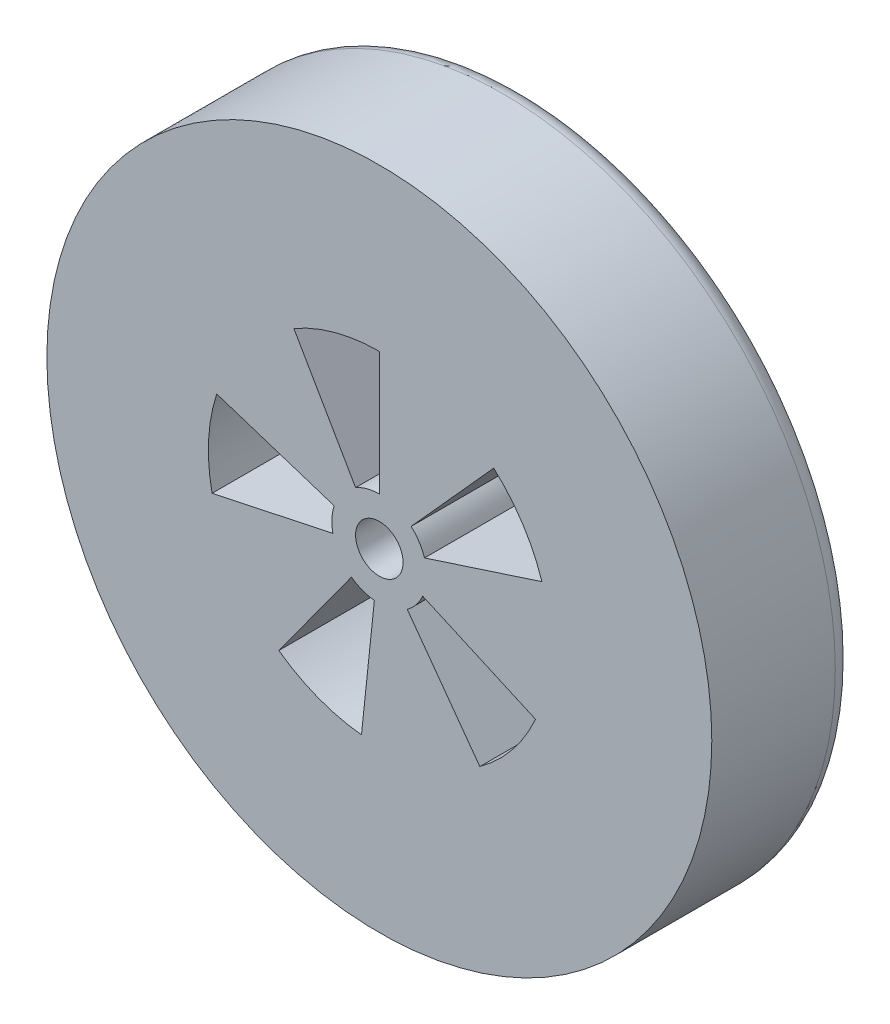
ISO-10303-21;
HEADER;
FILE_DESCRIPTION(('STEP AP214'),'2;1');
FILE_NAME('part.step','',(''),(''),'','','');
FILE_SCHEMA(('AUTOMOTIVE_DESIGN { 1 0 10303 214 1 1 1 1 }'));
ENDSEC;
DATA;
#1=APPLICATION_CONTEXT('core data for automotive mechanical design processes');
#2=APPLICATION_PROTOCOL_DEFINITION('international standard','automotive_design',2000,#1);
#3=PRODUCT_CONTEXT('',#1,'mechanical');
#4=PRODUCT('Part','Part','',(#3));
#5=PRODUCT_RELATED_PRODUCT_CATEGORY('part','',(#4));
#6=PRODUCT_DEFINITION_FORMATION('','',#4);
#7=PRODUCT_DEFINITION_CONTEXT('part definition',#1,'design');
#8=PRODUCT_DEFINITION('design','',#6,#7);
#9=PRODUCT_DEFINITION_SHAPE('','',#8);
#10=(LENGTH_UNIT() NAMED_UNIT(*) SI_UNIT(.MILLI.,.METRE.));
#11=(NAMED_UNIT(*) PLANE_ANGLE_UNIT() SI_UNIT($,.RADIAN.));
#12=(NAMED_UNIT(*) SI_UNIT($,.STERADIAN.) SOLID_ANGLE_UNIT());
#13=UNCERTAINTY_MEASURE_WITH_UNIT(LENGTH_MEASURE(1.E-05),#10,'distance_accuracy_value','');
#14=(GEOMETRIC_REPRESENTATION_CONTEXT(3) GLOBAL_UNCERTAINTY_ASSIGNED_CONTEXT((#13)) GLOBAL_UNIT_ASSIGNED_CONTEXT((#10,
#11,#12)) REPRESENTATION_CONTEXT('',''));
#15=CARTESIAN_POINT('',(0.,0.,0.));
#16=DIRECTION('',(0.,0.,1.));
#17=DIRECTION('',(1.,0.,0.));
#18=AXIS2_PLACEMENT_3D('',#15,#16,#17);
#19=CARTESIAN_POINT('',(0.,0.,15.));
#20=DIRECTION('',(0.,0.,-1.));
#21=DIRECTION('',(-1.,0.,0.));
#22=AXIS2_PLACEMENT_3D('',#19,#20,#21);
#23=CYLINDRICAL_SURFACE('',#22,35.);
#24=CARTESIAN_POINT('',(0.,0.,2.));
#25=DIRECTION('',(0.,0.,1.));
#26=DIRECTION('',(1.,0.,0.));
#27=AXIS2_PLACEMENT_3D('',#24,#25,#26);
#28=CIRCLE('',#27,35.);
#29=CARTESIAN_POINT('',(35.,0.,2.));
#30=VERTEX_POINT('',#29);
#31=EDGE_CURVE('E349',#30,#30,#28,.T.);
#32=ORIENTED_EDGE('',*,*,#31,.T.);
#33=EDGE_LOOP('',(#32));
#34=FACE_BOUND('',#33,.T.);
#35=CARTESIAN_POINT('',(0.,0.,15.));
#36=DIRECTION('',(0.,0.,1.));
#37=DIRECTION('',(1.,0.,0.));
#38=AXIS2_PLACEMENT_3D('',#35,#36,#37);
#39=CIRCLE('',#38,35.);
#40=CARTESIAN_POINT('',(35.,0.,15.));
#41=VERTEX_POINT('',#40);
#42=EDGE_CURVE('E346',#41,#41,#39,.T.);
#43=ORIENTED_EDGE('',*,*,#42,.F.);
#44=EDGE_LOOP('',(#43));
#45=FACE_BOUND('',#44,.T.);
#46=ADVANCED_FACE('F33',(#34,#45),#23,.T.);
#47=CARTESIAN_POINT('',(0.,0.,15.));
#48=DIRECTION('',(0.,0.,1.));
#49=DIRECTION('',(1.,0.,0.));
#50=AXIS2_PLACEMENT_3D('',#47,#48,#49);
#51=PLANE('',#50);
#52=CARTESIAN_POINT('',(0.,0.,15.));
#53=DIRECTION('',(0.,0.,1.));
#54=DIRECTION('',(1.,0.,0.));
#55=AXIS2_PLACEMENT_3D('',#52,#53,#54);
#56=CIRCLE('',#55,5.);
#57=CARTESIAN_POINT('',(4.75528258147575,1.54508497187479,15.));
#58=VERTEX_POINT('',#57);
#59=CARTESIAN_POINT('',(3.34565303179425,3.71572412738701,15.));
#60=VERTEX_POINT('',#59);
#61=EDGE_CURVE('E278',#58,#60,#56,.T.);
#62=ORIENTED_EDGE('',*,*,#61,.T.);
#63=DIRECTION('',(0.669130606358849,0.743144825477403,0.));
#64=VECTOR('',#63,1.);
#65=CARTESIAN_POINT('',(3.34565303179425,3.71572412738701,15.));
#66=LINE('',#65,#64);
#67=CARTESIAN_POINT('',(12.0443509144593,13.3766068585932,15.));
#68=VERTEX_POINT('',#67);
#69=EDGE_CURVE('E281',#60,#68,#66,.T.);
#70=ORIENTED_EDGE('',*,*,#69,.T.);
#71=CARTESIAN_POINT('',(0.,0.,15.));
#72=DIRECTION('',(0.,0.,-1.));
#73=DIRECTION('',(1.,0.,0.));
#74=AXIS2_PLACEMENT_3D('',#71,#72,#73);
#75=CIRCLE('',#74,18.);
#76=CARTESIAN_POINT('',(17.1190172933127,5.56230589874925,15.));
#77=VERTEX_POINT('',#76);
#78=EDGE_CURVE('E48',#68,#77,#75,.T.);
#79=ORIENTED_EDGE('',*,*,#78,.T.);
#80=DIRECTION('',(-0.95105651629515,-0.309016994374958,0.));
#81=VECTOR('',#80,1.);
#82=CARTESIAN_POINT('',(4.75528258147575,1.54508497187479,15.));
#83=LINE('',#82,#81);
#84=EDGE_CURVE('E286',#77,#58,#83,.T.);
#85=ORIENTED_EDGE('',*,*,#84,.T.);
#86=EDGE_LOOP('',(#62,#70,#79,#85));
#87=FACE_BOUND('',#86,.T.);
#88=CARTESIAN_POINT('',(0.,0.,15.));
#89=DIRECTION('',(0.,0.,1.));
#90=DIRECTION('',(1.,0.,0.));
#91=AXIS2_PLACEMENT_3D('',#88,#89,#90);
#92=CIRCLE('',#91,5.);
#93=CARTESIAN_POINT('',(2.9389262614624,-4.04508497187471,15.));
#94=VERTEX_POINT('',#93);
#95=CARTESIAN_POINT('',(4.56772728821303,-2.03368321537896,15.));
#96=VERTEX_POINT('',#95);
#97=EDGE_CURVE('E249',#94,#96,#92,.T.);
#98=ORIENTED_EDGE('',*,*,#97,.T.);
#99=DIRECTION('',(0.913545457642605,-0.406736643075791,0.));
#100=VECTOR('',#99,1.);
#101=CARTESIAN_POINT('',(4.56772728821303,-2.03368321537896,15.));
#102=LINE('',#101,#100);
#103=CARTESIAN_POINT('',(16.4438182375669,-7.32125957536424,15.));
#104=VERTEX_POINT('',#103);
#105=EDGE_CURVE('E252',#96,#104,#102,.T.);
#106=ORIENTED_EDGE('',*,*,#105,.T.);
#107=CARTESIAN_POINT('',(0.,0.,15.));
#108=DIRECTION('',(0.,0.,-1.));
#109=DIRECTION('',(1.,0.,0.));
#110=AXIS2_PLACEMENT_3D('',#107,#108,#109);
#111=CIRCLE('',#110,18.);
#112=CARTESIAN_POINT('',(10.5801345412646,-14.562305898749,15.));
#113=VERTEX_POINT('',#112);
#114=EDGE_CURVE('E56',#104,#113,#111,.T.);
#115=ORIENTED_EDGE('',*,*,#114,.T.);
#116=DIRECTION('',(-0.58778525229248,0.809016994374942,0.));
#117=VECTOR('',#116,1.);
#118=CARTESIAN_POINT('',(2.9389262614624,-4.04508497187471,15.));
#119=LINE('',#118,#117);
#120=EDGE_CURVE('E257',#113,#94,#119,.T.);
#121=ORIENTED_EDGE('',*,*,#120,.T.);
#122=EDGE_LOOP('',(#98,#106,#115,#121));
#123=FACE_BOUND('',#122,.T.);
#124=CARTESIAN_POINT('',(0.,0.,15.));
#125=DIRECTION('',(0.,0.,1.));
#126=DIRECTION('',(1.,0.,0.));
#127=AXIS2_PLACEMENT_3D('',#124,#125,#126);
#128=CIRCLE('',#127,5.);
#129=CARTESIAN_POINT('',(-2.93892626146234,-4.04508497187476,15.));
#130=VERTEX_POINT('',#129);
#131=CARTESIAN_POINT('',(-0.522642316338235,-4.97260947684137,15.));
#132=VERTEX_POINT('',#131);
#133=EDGE_CURVE('E217',#130,#132,#128,.T.);
#134=ORIENTED_EDGE('',*,*,#133,.T.);
#135=DIRECTION('',(-0.104528463267647,-0.994521895368274,0.));
#136=VECTOR('',#135,1.);
#137=CARTESIAN_POINT('',(-0.522642316338235,-4.97260947684137,15.));
#138=LINE('',#137,#136);
#139=CARTESIAN_POINT('',(-1.88151233881764,-17.9013941166289,15.));
#140=VERTEX_POINT('',#139);
#141=EDGE_CURVE('E220',#132,#140,#138,.T.);
#142=ORIENTED_EDGE('',*,*,#141,.T.);
#143=CARTESIAN_POINT('',(0.,0.,15.));
#144=DIRECTION('',(0.,0.,-1.));
#145=DIRECTION('',(1.,0.,0.));
#146=AXIS2_PLACEMENT_3D('',#143,#144,#145);
#147=CIRCLE('',#146,18.);
#148=CARTESIAN_POINT('',(-10.5801345412644,-14.5623058987491,15.));
#149=VERTEX_POINT('',#148);
#150=EDGE_CURVE('E224',#140,#149,#147,.T.);
#151=ORIENTED_EDGE('',*,*,#150,.T.);
#152=DIRECTION('',(0.587785252292469,0.809016994374951,0.));
#153=VECTOR('',#152,1.);
#154=CARTESIAN_POINT('',(-2.93892626146234,-4.04508497187476,15.));
#155=LINE('',#154,#153);
#156=EDGE_CURVE('E227',#149,#130,#155,.T.);
#157=ORIENTED_EDGE('',*,*,#156,.T.);
#158=EDGE_LOOP('',(#134,#142,#151,#157));
#159=FACE_BOUND('',#158,.T.);
#160=CARTESIAN_POINT('',(0.,0.,15.));
#161=DIRECTION('',(0.,0.,1.));
#162=DIRECTION('',(1.,0.,0.));
#163=AXIS2_PLACEMENT_3D('',#160,#161,#162);
#164=CIRCLE('',#163,5.);
#165=CARTESIAN_POINT('',(-4.75528258147577,1.54508497187472,15.));
#166=VERTEX_POINT('',#165);
#167=CARTESIAN_POINT('',(-4.89073800366903,-1.03955845408882,15.));
#168=VERTEX_POINT('',#167);
#169=EDGE_CURVE('E176',#166,#168,#164,.T.);
#170=ORIENTED_EDGE('',*,*,#169,.T.);
#171=DIRECTION('',(-0.978147600733805,-0.207911690817763,0.));
#172=VECTOR('',#171,1.);
#173=CARTESIAN_POINT('',(-4.89073800366903,-1.03955845408882,15.));
#174=LINE('',#173,#172);
#175=CARTESIAN_POINT('',(-17.6066568132085,-3.74241043471974,15.));
#176=VERTEX_POINT('',#175);
#177=EDGE_CURVE('E187',#168,#176,#174,.T.);
#178=ORIENTED_EDGE('',*,*,#177,.T.);
#179=CARTESIAN_POINT('',(0.,0.,15.));
#180=DIRECTION('',(0.,0.,-1.));
#181=DIRECTION('',(1.,0.,0.));
#182=AXIS2_PLACEMENT_3D('',#179,#180,#181);
#183=CIRCLE('',#182,18.);
#184=CARTESIAN_POINT('',(-17.1190172933128,5.56230589874901,15.));
#185=VERTEX_POINT('',#184);
#186=EDGE_CURVE('E192',#176,#185,#183,.T.);
#187=ORIENTED_EDGE('',*,*,#186,.T.);
#188=DIRECTION('',(0.951056516295154,-0.309016994374945,0.));
#189=VECTOR('',#188,1.);
#190=CARTESIAN_POINT('',(-4.75528258147577,1.54508497187472,15.));
#191=LINE('',#190,#189);
#192=EDGE_CURVE('E183',#185,#166,#191,.T.);
#193=ORIENTED_EDGE('',*,*,#192,.T.);
#194=EDGE_LOOP('',(#170,#178,#187,#193));
#195=FACE_BOUND('',#194,.T.);
#196=CARTESIAN_POINT('',(0.,0.,15.));
#197=DIRECTION('',(0.,0.,1.));
#198=DIRECTION('',(1.,0.,0.));
#199=AXIS2_PLACEMENT_3D('',#196,#197,#198);
#200=CIRCLE('',#199,5.);
#201=CARTESIAN_POINT('',(0.,5.,15.));
#202=VERTEX_POINT('',#201);
#203=CARTESIAN_POINT('',(-2.5,4.33012701892219,15.));
#204=VERTEX_POINT('',#203);
#205=EDGE_CURVE('E306',#202,#204,#200,.T.);
#206=ORIENTED_EDGE('',*,*,#205,.T.);
#207=DIRECTION('',(-0.500000000000001,0.866025403784438,0.));
#208=VECTOR('',#207,1.);
#209=CARTESIAN_POINT('',(-2.5,4.33012701892219,15.));
#210=LINE('',#209,#208);
#211=CARTESIAN_POINT('',(-9.00000000000002,15.5884572681199,15.));
#212=VERTEX_POINT('',#211);
#213=EDGE_CURVE('E309',#204,#212,#210,.T.);
#214=ORIENTED_EDGE('',*,*,#213,.T.);
#215=CARTESIAN_POINT('',(0.,0.,15.));
#216=DIRECTION('',(0.,0.,-1.));
#217=DIRECTION('',(1.,0.,0.));
#218=AXIS2_PLACEMENT_3D('',#215,#216,#217);
#219=CIRCLE('',#218,18.);
#220=CARTESIAN_POINT('',(0.,18.,15.));
#221=VERTEX_POINT('',#220);
#222=EDGE_CURVE('E313',#212,#221,#219,.T.);
#223=ORIENTED_EDGE('',*,*,#222,.T.);
#224=DIRECTION('',(0.,-1.,0.));
#225=VECTOR('',#224,1.);
#226=CARTESIAN_POINT('',(0.,5.,15.));
#227=LINE('',#226,#225);
#228=EDGE_CURVE('E316',#221,#202,#227,.T.);
#229=ORIENTED_EDGE('',*,*,#228,.T.);
#230=EDGE_LOOP('',(#206,#214,#223,#229));
#231=FACE_BOUND('',#230,.T.);
#232=CARTESIAN_POINT('',(0.,0.,15.));
#233=DIRECTION('',(0.,0.,-1.));
#234=DIRECTION('',(-1.,0.,0.));
#235=AXIS2_PLACEMENT_3D('',#232,#233,#234);
#236=CIRCLE('',#235,2.5);
#237=CARTESIAN_POINT('',(-2.5,0.,15.));
#238=VERTEX_POINT('',#237);
#239=EDGE_CURVE('E338',#238,#238,#236,.T.);
#240=ORIENTED_EDGE('',*,*,#239,.T.);
#241=EDGE_LOOP('',(#240));
#242=FACE_BOUND('',#241,.T.);
#243=ORIENTED_EDGE('',*,*,#42,.T.);
#244=EDGE_LOOP('',(#243));
#245=FACE_BOUND('',#244,.T.);
#246=ADVANCED_FACE('F194',(#87,#123,#159,#195,#231,#242,#245),#51,.T.);
#247=CARTESIAN_POINT('',(0.,0.,0.));
#248=DIRECTION('',(0.,0.,1.));
#249=DIRECTION('',(1.,0.,0.));
#250=AXIS2_PLACEMENT_3D('',#247,#248,#249);
#251=PLANE('',#250);
#252=CARTESIAN_POINT('',(0.,0.,0.));
#253=DIRECTION('',(0.,0.,1.));
#254=DIRECTION('',(1.,0.,0.));
#255=AXIS2_PLACEMENT_3D('',#252,#253,#254);
#256=CIRCLE('',#255,33.);
#257=CARTESIAN_POINT('',(33.,0.,0.));
#258=VERTEX_POINT('',#257);
#259=EDGE_CURVE('E352',#258,#258,#256,.F.);
#260=ORIENTED_EDGE('',*,*,#259,.T.);
#261=EDGE_LOOP('',(#260));
#262=FACE_BOUND('',#261,.T.);
#263=CARTESIAN_POINT('',(0.,0.,0.));
#264=DIRECTION('',(0.,0.,-1.));
#265=DIRECTION('',(-1.,0.,0.));
#266=AXIS2_PLACEMENT_3D('',#263,#264,#265);
#267=CIRCLE('',#266,20.);
#268=CARTESIAN_POINT('',(-20.,0.,0.));
#269=VERTEX_POINT('',#268);
#270=EDGE_CURVE('E341',#269,#269,#267,.T.);
#271=ORIENTED_EDGE('',*,*,#270,.F.);
#272=EDGE_LOOP('',(#271));
#273=FACE_BOUND('',#272,.T.);
#274=ADVANCED_FACE('F415',(#262,#273),#251,.F.);
#275=CARTESIAN_POINT('',(0.,0.,3.));
#276=DIRECTION('',(0.,0.,-1.));
#277=DIRECTION('',(-1.,0.,0.));
#278=AXIS2_PLACEMENT_3D('',#275,#276,#277);
#279=CYLINDRICAL_SURFACE('',#278,20.);
#280=CARTESIAN_POINT('',(0.,0.,1.));
#281=DIRECTION('',(0.,0.,-1.));
#282=DIRECTION('',(-1.,0.,0.));
#283=AXIS2_PLACEMENT_3D('',#280,#281,#282);
#284=CIRCLE('',#283,20.);
#285=CARTESIAN_POINT('',(-20.,0.,1.));
#286=VERTEX_POINT('',#285);
#287=EDGE_CURVE('E11',#286,#286,#284,.F.);
#288=ORIENTED_EDGE('',*,*,#287,.T.);
#289=EDGE_LOOP('',(#288));
#290=FACE_BOUND('',#289,.T.);
#291=ORIENTED_EDGE('',*,*,#270,.T.);
#292=EDGE_LOOP('',(#291));
#293=FACE_BOUND('',#292,.T.);
#294=ADVANCED_FACE('F429',(#290,#293),#279,.F.);
#295=CARTESIAN_POINT('',(0.,0.,3.));
#296=DIRECTION('',(0.,0.,-1.));
#297=DIRECTION('',(-1.,0.,0.));
#298=AXIS2_PLACEMENT_3D('',#295,#296,#297);
#299=PLANE('',#298);
#300=DIRECTION('',(-0.95105651629515,-0.309016994374958,0.));
#301=VECTOR('',#300,1.);
#302=CARTESIAN_POINT('',(4.75528258147575,1.54508497187479,3.));
#303=LINE('',#302,#301);
#304=CARTESIAN_POINT('',(17.1190172933127,5.56230589874925,3.));
#305=VERTEX_POINT('',#304);
#306=CARTESIAN_POINT('',(4.75528258147575,1.54508497187479,3.));
#307=VERTEX_POINT('',#306);
#308=EDGE_CURVE('E282',#305,#307,#303,.T.);
#309=ORIENTED_EDGE('',*,*,#308,.F.);
#310=CARTESIAN_POINT('',(0.,0.,3.));
#311=DIRECTION('',(0.,0.,-1.));
#312=DIRECTION('',(-1.,0.,0.));
#313=AXIS2_PLACEMENT_3D('',#310,#311,#312);
#314=CIRCLE('',#313,18.);
#315=CARTESIAN_POINT('',(16.4438182375669,-7.32125957536424,3.));
#316=VERTEX_POINT('',#315);
#317=EDGE_CURVE('E362',#305,#316,#314,.T.);
#318=ORIENTED_EDGE('',*,*,#317,.T.);
#319=DIRECTION('',(0.913545457642605,-0.406736643075791,0.));
#320=VECTOR('',#319,1.);
#321=CARTESIAN_POINT('',(4.56772728821303,-2.03368321537896,3.));
#322=LINE('',#321,#320);
#323=CARTESIAN_POINT('',(4.56772728821303,-2.03368321537896,3.));
#324=VERTEX_POINT('',#323);
#325=EDGE_CURVE('E264',#324,#316,#322,.T.);
#326=ORIENTED_EDGE('',*,*,#325,.F.);
#327=CARTESIAN_POINT('',(0.,0.,3.));
#328=DIRECTION('',(0.,0.,1.));
#329=DIRECTION('',(1.,0.,0.));
#330=AXIS2_PLACEMENT_3D('',#327,#328,#329);
#331=CIRCLE('',#330,5.);
#332=CARTESIAN_POINT('',(2.9389262614624,-4.04508497187471,3.));
#333=VERTEX_POINT('',#332);
#334=EDGE_CURVE('E261',#333,#324,#331,.T.);
#335=ORIENTED_EDGE('',*,*,#334,.F.);
#336=DIRECTION('',(-0.58778525229248,0.809016994374942,0.));
#337=VECTOR('',#336,1.);
#338=CARTESIAN_POINT('',(2.9389262614624,-4.04508497187471,3.));
#339=LINE('',#338,#337);
#340=CARTESIAN_POINT('',(10.5801345412646,-14.562305898749,3.));
#341=VERTEX_POINT('',#340);
#342=EDGE_CURVE('E253',#341,#333,#339,.T.);
#343=ORIENTED_EDGE('',*,*,#342,.F.);
#344=CARTESIAN_POINT('',(-1.88151233881764,-17.9013941166289,3.));
#345=VERTEX_POINT('',#344);
#346=EDGE_CURVE('E364',#341,#345,#314,.T.);
#347=ORIENTED_EDGE('',*,*,#346,.T.);
#348=DIRECTION('',(-0.104528463267647,-0.994521895368274,0.));
#349=VECTOR('',#348,1.);
#350=CARTESIAN_POINT('',(-0.522642316338235,-4.97260947684137,3.));
#351=LINE('',#350,#349);
#352=CARTESIAN_POINT('',(-0.522642316338235,-4.97260947684137,3.));
#353=VERTEX_POINT('',#352);
#354=EDGE_CURVE('E234',#353,#345,#351,.T.);
#355=ORIENTED_EDGE('',*,*,#354,.F.);
#356=CARTESIAN_POINT('',(0.,0.,3.));
#357=DIRECTION('',(0.,0.,1.));
#358=DIRECTION('',(1.,0.,0.));
#359=AXIS2_PLACEMENT_3D('',#356,#357,#358);
#360=CIRCLE('',#359,5.);
#361=CARTESIAN_POINT('',(-2.93892626146234,-4.04508497187476,3.));
#362=VERTEX_POINT('',#361);
#363=EDGE_CURVE('E231',#362,#353,#360,.T.);
#364=ORIENTED_EDGE('',*,*,#363,.F.);
#365=DIRECTION('',(0.587785252292469,0.809016994374951,0.));
#366=VECTOR('',#365,1.);
#367=CARTESIAN_POINT('',(-2.93892626146234,-4.04508497187476,3.));
#368=LINE('',#367,#366);
#369=CARTESIAN_POINT('',(-10.5801345412644,-14.5623058987491,3.));
#370=VERTEX_POINT('',#369);
#371=EDGE_CURVE('E221',#370,#362,#368,.T.);
#372=ORIENTED_EDGE('',*,*,#371,.F.);
#373=CARTESIAN_POINT('',(-17.6066568132085,-3.74241043471974,3.));
#374=VERTEX_POINT('',#373);
#375=EDGE_CURVE('E354',#370,#374,#314,.T.);
#376=ORIENTED_EDGE('',*,*,#375,.T.);
#377=DIRECTION('',(-0.978147600733805,-0.207911690817763,0.));
#378=VECTOR('',#377,1.);
#379=CARTESIAN_POINT('',(-4.89073800366903,-1.03955845408882,3.));
#380=LINE('',#379,#378);
#381=CARTESIAN_POINT('',(-4.89073800366903,-1.03955845408882,3.));
#382=VERTEX_POINT('',#381);
#383=EDGE_CURVE('E206',#382,#374,#380,.T.);
#384=ORIENTED_EDGE('',*,*,#383,.F.);
#385=CARTESIAN_POINT('',(0.,0.,3.));
#386=DIRECTION('',(0.,0.,1.));
#387=DIRECTION('',(1.,0.,0.));
#388=AXIS2_PLACEMENT_3D('',#385,#386,#387);
#389=CIRCLE('',#388,5.);
#390=CARTESIAN_POINT('',(-4.75528258147577,1.54508497187472,3.));
#391=VERTEX_POINT('',#390);
#392=EDGE_CURVE('E179',#391,#382,#389,.T.);
#393=ORIENTED_EDGE('',*,*,#392,.F.);
#394=DIRECTION('',(0.951056516295154,-0.309016994374945,0.));
#395=VECTOR('',#394,1.);
#396=CARTESIAN_POINT('',(-4.75528258147577,1.54508497187472,3.));
#397=LINE('',#396,#395);
#398=CARTESIAN_POINT('',(-17.1190172933128,5.56230589874901,3.));
#399=VERTEX_POINT('',#398);
#400=EDGE_CURVE('E197',#399,#391,#397,.T.);
#401=ORIENTED_EDGE('',*,*,#400,.F.);
#402=CARTESIAN_POINT('',(-9.00000000000002,15.5884572681199,3.));
#403=VERTEX_POINT('',#402);
#404=EDGE_CURVE('E41',#399,#403,#314,.T.);
#405=ORIENTED_EDGE('',*,*,#404,.T.);
#406=DIRECTION('',(-0.500000000000001,0.866025403784438,0.));
#407=VECTOR('',#406,1.);
#408=CARTESIAN_POINT('',(-2.5,4.33012701892219,3.));
#409=LINE('',#408,#407);
#410=CARTESIAN_POINT('',(-2.5,4.33012701892219,3.));
#411=VERTEX_POINT('',#410);
#412=EDGE_CURVE('E322',#411,#403,#409,.T.);
#413=ORIENTED_EDGE('',*,*,#412,.F.);
#414=CARTESIAN_POINT('',(0.,0.,3.));
#415=DIRECTION('',(0.,0.,1.));
#416=DIRECTION('',(1.,0.,0.));
#417=AXIS2_PLACEMENT_3D('',#414,#415,#416);
#418=CIRCLE('',#417,5.);
#419=CARTESIAN_POINT('',(0.,5.,3.));
#420=VERTEX_POINT('',#419);
#421=EDGE_CURVE('E213',#420,#411,#418,.T.);
#422=ORIENTED_EDGE('',*,*,#421,.F.);
#423=DIRECTION('',(0.,-1.,0.));
#424=VECTOR('',#423,1.);
#425=CARTESIAN_POINT('',(0.,5.,3.));
#426=LINE('',#425,#424);
#427=CARTESIAN_POINT('',(0.,18.,3.));
#428=VERTEX_POINT('',#427);
#429=EDGE_CURVE('E310',#428,#420,#426,.T.);
#430=ORIENTED_EDGE('',*,*,#429,.F.);
#431=CARTESIAN_POINT('',(12.0443509144593,13.3766068585932,3.));
#432=VERTEX_POINT('',#431);
#433=EDGE_CURVE('E356',#428,#432,#314,.T.);
#434=ORIENTED_EDGE('',*,*,#433,.T.);
#435=DIRECTION('',(0.669130606358849,0.743144825477403,0.));
#436=VECTOR('',#435,1.);
#437=CARTESIAN_POINT('',(3.34565303179425,3.71572412738701,3.));
#438=LINE('',#437,#436);
#439=CARTESIAN_POINT('',(3.34565303179425,3.71572412738701,3.));
#440=VERTEX_POINT('',#439);
#441=EDGE_CURVE('E293',#440,#432,#438,.T.);
#442=ORIENTED_EDGE('',*,*,#441,.F.);
#443=CARTESIAN_POINT('',(0.,0.,3.));
#444=DIRECTION('',(0.,0.,1.));
#445=DIRECTION('',(1.,0.,0.));
#446=AXIS2_PLACEMENT_3D('',#443,#444,#445);
#447=CIRCLE('',#446,5.);
#448=EDGE_CURVE('E290',#307,#440,#447,.T.);
#449=ORIENTED_EDGE('',*,*,#448,.F.);
#450=EDGE_LOOP('',(#309,#318,#326,#335,#343,#347,#355,#364,#372,#376,#384,#393,#401,#405,#413,
#422,#430,#434,#442,#449));
#451=FACE_BOUND('',#450,.T.);
#452=CARTESIAN_POINT('',(0.,0.,3.));
#453=DIRECTION('',(0.,0.,-1.));
#454=DIRECTION('',(-1.,0.,0.));
#455=AXIS2_PLACEMENT_3D('',#452,#453,#454);
#456=CIRCLE('',#455,2.5);
#457=CARTESIAN_POINT('',(-2.5,0.,3.));
#458=VERTEX_POINT('',#457);
#459=EDGE_CURVE('E331',#458,#458,#456,.T.);
#460=ORIENTED_EDGE('',*,*,#459,.F.);
#461=EDGE_LOOP('',(#460));
#462=FACE_BOUND('',#461,.T.);
#463=ADVANCED_FACE('F375',(#451,#462),#299,.T.);
#464=CARTESIAN_POINT('',(0.,0.,2.));
#465=DIRECTION('',(0.,0.,1.));
#466=DIRECTION('',(1.,0.,0.));
#467=AXIS2_PLACEMENT_3D('',#464,#465,#466);
#468=TOROIDAL_SURFACE('',#467,33.,2.);
#469=ORIENTED_EDGE('',*,*,#259,.F.);
#470=EDGE_LOOP('',(#469));
#471=FACE_BOUND('',#470,.T.);
#472=ORIENTED_EDGE('',*,*,#31,.F.);
#473=EDGE_LOOP('',(#472));
#474=FACE_BOUND('',#473,.T.);
#475=ADVANCED_FACE('F420',(#471,#474),#468,.T.);
#476=CARTESIAN_POINT('',(0.,0.,1.));
#477=DIRECTION('',(0.,0.,-1.));
#478=DIRECTION('',(-1.,0.,0.));
#479=AXIS2_PLACEMENT_3D('',#476,#477,#478);
#480=TOROIDAL_SURFACE('',#479,18.,2.);
#481=ORIENTED_EDGE('',*,*,#287,.F.);
#482=EDGE_LOOP('',(#481));
#483=FACE_BOUND('',#482,.T.);
#484=ORIENTED_EDGE('',*,*,#404,.F.);
#485=CARTESIAN_POINT('',(0.,0.,3.));
#486=DIRECTION('',(0.,0.,-1.));
#487=DIRECTION('',(1.,0.,0.));
#488=AXIS2_PLACEMENT_3D('',#485,#486,#487);
#489=CIRCLE('',#488,18.);
#490=EDGE_CURVE('E200',#374,#399,#489,.T.);
#491=ORIENTED_EDGE('',*,*,#490,.F.);
#492=ORIENTED_EDGE('',*,*,#375,.F.);
#493=CARTESIAN_POINT('',(0.,0.,3.));
#494=DIRECTION('',(0.,0.,-1.));
#495=DIRECTION('',(1.,0.,0.));
#496=AXIS2_PLACEMENT_3D('',#493,#494,#495);
#497=CIRCLE('',#496,18.);
#498=EDGE_CURVE('E237',#345,#370,#497,.T.);
#499=ORIENTED_EDGE('',*,*,#498,.F.);
#500=ORIENTED_EDGE('',*,*,#346,.F.);
#501=CARTESIAN_POINT('',(0.,0.,3.));
#502=DIRECTION('',(0.,0.,-1.));
#503=DIRECTION('',(1.,0.,0.));
#504=AXIS2_PLACEMENT_3D('',#501,#502,#503);
#505=CIRCLE('',#504,18.);
#506=EDGE_CURVE('E267',#316,#341,#505,.T.);
#507=ORIENTED_EDGE('',*,*,#506,.F.);
#508=ORIENTED_EDGE('',*,*,#317,.F.);
#509=CARTESIAN_POINT('',(0.,0.,3.));
#510=DIRECTION('',(0.,0.,-1.));
#511=DIRECTION('',(1.,0.,0.));
#512=AXIS2_PLACEMENT_3D('',#509,#510,#511);
#513=CIRCLE('',#512,18.);
#514=EDGE_CURVE('E295',#432,#305,#513,.T.);
#515=ORIENTED_EDGE('',*,*,#514,.F.);
#516=ORIENTED_EDGE('',*,*,#433,.F.);
#517=CARTESIAN_POINT('',(0.,0.,3.));
#518=DIRECTION('',(0.,0.,-1.));
#519=DIRECTION('',(1.,0.,0.));
#520=AXIS2_PLACEMENT_3D('',#517,#518,#519);
#521=CIRCLE('',#520,18.);
#522=EDGE_CURVE('E324',#403,#428,#521,.T.);
#523=ORIENTED_EDGE('',*,*,#522,.F.);
#524=EDGE_LOOP('',(#484,#491,#492,#499,#500,#507,#508,#515,#516,#523));
#525=FACE_BOUND('',#524,.T.);
#526=ADVANCED_FACE('F35',(#483,#525),#480,.F.);
#527=CARTESIAN_POINT('',(0.,0.,15.));
#528=DIRECTION('',(0.,0.,-1.));
#529=DIRECTION('',(-1.,0.,0.));
#530=AXIS2_PLACEMENT_3D('',#527,#528,#529);
#531=CYLINDRICAL_SURFACE('',#530,2.5);
#532=ORIENTED_EDGE('',*,*,#239,.F.);
#533=EDGE_LOOP('',(#532));
#534=FACE_BOUND('',#533,.T.);
#535=ORIENTED_EDGE('',*,*,#459,.T.);
#536=EDGE_LOOP('',(#535));
#537=FACE_BOUND('',#536,.T.);
#538=ADVANCED_FACE('F427',(#534,#537),#531,.F.);
#539=CARTESIAN_POINT('',(0.,0.,15.));
#540=DIRECTION('',(0.,0.,-1.));
#541=DIRECTION('',(-1.,0.,0.));
#542=AXIS2_PLACEMENT_3D('',#539,#540,#541);
#543=CYLINDRICAL_SURFACE('',#542,5.);
#544=ORIENTED_EDGE('',*,*,#421,.T.);
#545=DIRECTION('',(0.,0.,-1.));
#546=VECTOR('',#545,1.);
#547=CARTESIAN_POINT('',(-2.5,4.33012701892219,15.));
#548=LINE('',#547,#546);
#549=EDGE_CURVE('E319',#204,#411,#548,.T.);
#550=ORIENTED_EDGE('',*,*,#549,.F.);
#551=ORIENTED_EDGE('',*,*,#205,.F.);
#552=DIRECTION('',(0.,0.,-1.));
#553=VECTOR('',#552,1.);
#554=CARTESIAN_POINT('',(0.,5.,15.));
#555=LINE('',#554,#553);
#556=EDGE_CURVE('E329',#202,#420,#555,.T.);
#557=ORIENTED_EDGE('',*,*,#556,.T.);
#558=EDGE_LOOP('',(#544,#550,#551,#557));
#559=FACE_BOUND('',#558,.T.);
#560=ADVANCED_FACE('F447',(#559),#543,.T.);
#561=CARTESIAN_POINT('',(0.,5.,15.));
#562=DIRECTION('',(1.,0.,0.));
#563=DIRECTION('',(0.,0.,-1.));
#564=AXIS2_PLACEMENT_3D('',#561,#562,#563);
#565=PLANE('',#564);
#566=ORIENTED_EDGE('',*,*,#429,.T.);
#567=ORIENTED_EDGE('',*,*,#556,.F.);
#568=ORIENTED_EDGE('',*,*,#228,.F.);
#569=DIRECTION('',(0.,0.,-1.));
#570=VECTOR('',#569,1.);
#571=CARTESIAN_POINT('',(0.,18.,15.));
#572=LINE('',#571,#570);
#573=EDGE_CURVE('E332',#221,#428,#572,.T.);
#574=ORIENTED_EDGE('',*,*,#573,.T.);
#575=EDGE_LOOP('',(#566,#567,#568,#574));
#576=FACE_BOUND('',#575,.T.);
#577=ADVANCED_FACE('F451',(#576),#565,.F.);
#578=CARTESIAN_POINT('',(0.,0.,15.));
#579=DIRECTION('',(0.,0.,-1.));
#580=DIRECTION('',(-1.,0.,0.));
#581=AXIS2_PLACEMENT_3D('',#578,#579,#580);
#582=CYLINDRICAL_SURFACE('',#581,18.);
#583=ORIENTED_EDGE('',*,*,#522,.T.);
#584=ORIENTED_EDGE('',*,*,#573,.F.);
#585=ORIENTED_EDGE('',*,*,#222,.F.);
#586=DIRECTION('',(0.,0.,-1.));
#587=VECTOR('',#586,1.);
#588=CARTESIAN_POINT('',(-9.00000000000002,15.5884572681199,15.));
#589=LINE('',#588,#587);
#590=EDGE_CURVE('E334',#212,#403,#589,.T.);
#591=ORIENTED_EDGE('',*,*,#590,.T.);
#592=EDGE_LOOP('',(#583,#584,#585,#591));
#593=FACE_BOUND('',#592,.T.);
#594=ADVANCED_FACE('F456',(#593),#582,.F.);
#595=CARTESIAN_POINT('',(-2.5,4.33012701892219,15.));
#596=DIRECTION('',(-0.866025403784438,-0.500000000000001,0.));
#597=DIRECTION('',(0.500000000000001,-0.866025403784438,0.));
#598=AXIS2_PLACEMENT_3D('',#595,#596,#597);
#599=PLANE('',#598);
#600=ORIENTED_EDGE('',*,*,#412,.T.);
#601=ORIENTED_EDGE('',*,*,#590,.F.);
#602=ORIENTED_EDGE('',*,*,#213,.F.);
#603=ORIENTED_EDGE('',*,*,#549,.T.);
#604=EDGE_LOOP('',(#600,#601,#602,#603));
#605=FACE_BOUND('',#604,.T.);
#606=ADVANCED_FACE('F453',(#605),#599,.F.);
#607=CARTESIAN_POINT('',(0.,0.,15.));
#608=DIRECTION('',(0.,0.,-1.));
#609=DIRECTION('',(-1.,0.,0.));
#610=AXIS2_PLACEMENT_3D('',#607,#608,#609);
#611=CYLINDRICAL_SURFACE('',#610,5.);
#612=ORIENTED_EDGE('',*,*,#392,.T.);
#613=DIRECTION('',(0.,0.,-1.));
#614=VECTOR('',#613,1.);
#615=CARTESIAN_POINT('',(-4.89073800366903,-1.03955845408882,15.));
#616=LINE('',#615,#614);
#617=EDGE_CURVE('E172',#168,#382,#616,.T.);
#618=ORIENTED_EDGE('',*,*,#617,.F.);
#619=ORIENTED_EDGE('',*,*,#169,.F.);
#620=DIRECTION('',(0.,0.,-1.));
#621=VECTOR('',#620,1.);
#622=CARTESIAN_POINT('',(-4.75528258147577,1.54508497187472,15.));
#623=LINE('',#622,#621);
#624=EDGE_CURVE('E211',#166,#391,#623,.T.);
#625=ORIENTED_EDGE('',*,*,#624,.T.);
#626=EDGE_LOOP('',(#612,#618,#619,#625));
#627=FACE_BOUND('',#626,.T.);
#628=ADVANCED_FACE('F174',(#627),#611,.T.);
#629=CARTESIAN_POINT('',(-4.75528258147577,1.54508497187472,15.));
#630=DIRECTION('',(0.309016994374945,0.951056516295154,0.));
#631=DIRECTION('',(-0.951056516295155,0.309016994374945,0.));
#632=AXIS2_PLACEMENT_3D('',#629,#630,#631);
#633=PLANE('',#632);
#634=ORIENTED_EDGE('',*,*,#400,.T.);
#635=ORIENTED_EDGE('',*,*,#624,.F.);
#636=ORIENTED_EDGE('',*,*,#192,.F.);
#637=DIRECTION('',(0.,0.,-1.));
#638=VECTOR('',#637,1.);
#639=CARTESIAN_POINT('',(-17.1190172933128,5.56230589874901,15.));
#640=LINE('',#639,#638);
#641=EDGE_CURVE('E214',#185,#399,#640,.T.);
#642=ORIENTED_EDGE('',*,*,#641,.T.);
#643=EDGE_LOOP('',(#634,#635,#636,#642));
#644=FACE_BOUND('',#643,.T.);
#645=ADVANCED_FACE('F500',(#644),#633,.F.);
#646=CARTESIAN_POINT('',(0.,0.,15.));
#647=DIRECTION('',(0.,0.,-1.));
#648=DIRECTION('',(-1.,0.,0.));
#649=AXIS2_PLACEMENT_3D('',#646,#647,#648);
#650=CYLINDRICAL_SURFACE('',#649,18.);
#651=ORIENTED_EDGE('',*,*,#490,.T.);
#652=ORIENTED_EDGE('',*,*,#641,.F.);
#653=ORIENTED_EDGE('',*,*,#186,.F.);
#654=DIRECTION('',(0.,0.,-1.));
#655=VECTOR('',#654,1.);
#656=CARTESIAN_POINT('',(-17.6066568132085,-3.74241043471973,15.));
#657=LINE('',#656,#655);
#658=EDGE_CURVE('E182',#176,#374,#657,.T.);
#659=ORIENTED_EDGE('',*,*,#658,.T.);
#660=EDGE_LOOP('',(#651,#652,#653,#659));
#661=FACE_BOUND('',#660,.T.);
#662=ADVANCED_FACE('F498',(#661),#650,.F.);
#663=CARTESIAN_POINT('',(-4.89073800366903,-1.03955845408882,15.));
#664=DIRECTION('',(0.207911690817763,-0.978147600733805,0.));
#665=DIRECTION('',(0.978147600733805,0.207911690817763,0.));
#666=AXIS2_PLACEMENT_3D('',#663,#664,#665);
#667=PLANE('',#666);
#668=ORIENTED_EDGE('',*,*,#383,.T.);
#669=ORIENTED_EDGE('',*,*,#658,.F.);
#670=ORIENTED_EDGE('',*,*,#177,.F.);
#671=ORIENTED_EDGE('',*,*,#617,.T.);
#672=EDGE_LOOP('',(#668,#669,#670,#671));
#673=FACE_BOUND('',#672,.T.);
#674=ADVANCED_FACE('F188',(#673),#667,.F.);
#675=CARTESIAN_POINT('',(0.,0.,15.));
#676=DIRECTION('',(0.,0.,-1.));
#677=DIRECTION('',(-1.,0.,0.));
#678=AXIS2_PLACEMENT_3D('',#675,#676,#677);
#679=CYLINDRICAL_SURFACE('',#678,5.);
#680=ORIENTED_EDGE('',*,*,#363,.T.);
#681=DIRECTION('',(0.,0.,-1.));
#682=VECTOR('',#681,1.);
#683=CARTESIAN_POINT('',(-0.522642316338235,-4.97260947684137,15.));
#684=LINE('',#683,#682);
#685=EDGE_CURVE('E230',#132,#353,#684,.T.);
#686=ORIENTED_EDGE('',*,*,#685,.F.);
#687=ORIENTED_EDGE('',*,*,#133,.F.);
#688=DIRECTION('',(0.,0.,-1.));
#689=VECTOR('',#688,1.);
#690=CARTESIAN_POINT('',(-2.93892626146234,-4.04508497187476,15.));
#691=LINE('',#690,#689);
#692=EDGE_CURVE('E207',#130,#362,#691,.T.);
#693=ORIENTED_EDGE('',*,*,#692,.T.);
#694=EDGE_LOOP('',(#680,#686,#687,#693));
#695=FACE_BOUND('',#694,.T.);
#696=ADVANCED_FACE('F511',(#695),#679,.T.);
#697=CARTESIAN_POINT('',(-2.93892626146234,-4.04508497187476,15.));
#698=DIRECTION('',(-0.809016994374951,0.587785252292468,0.));
#699=DIRECTION('',(-0.587785252292469,-0.809016994374951,0.));
#700=AXIS2_PLACEMENT_3D('',#697,#698,#699);
#701=PLANE('',#700);
#702=ORIENTED_EDGE('',*,*,#371,.T.);
#703=ORIENTED_EDGE('',*,*,#692,.F.);
#704=ORIENTED_EDGE('',*,*,#156,.F.);
#705=DIRECTION('',(0.,0.,-1.));
#706=VECTOR('',#705,1.);
#707=CARTESIAN_POINT('',(-10.5801345412644,-14.5623058987491,15.));
#708=LINE('',#707,#706);
#709=EDGE_CURVE('E243',#149,#370,#708,.T.);
#710=ORIENTED_EDGE('',*,*,#709,.T.);
#711=EDGE_LOOP('',(#702,#703,#704,#710));
#712=FACE_BOUND('',#711,.T.);
#713=ADVANCED_FACE('F513',(#712),#701,.F.);
#714=CARTESIAN_POINT('',(0.,0.,15.));
#715=DIRECTION('',(0.,0.,-1.));
#716=DIRECTION('',(-1.,0.,0.));
#717=AXIS2_PLACEMENT_3D('',#714,#715,#716);
#718=CYLINDRICAL_SURFACE('',#717,18.);
#719=ORIENTED_EDGE('',*,*,#498,.T.);
#720=ORIENTED_EDGE('',*,*,#709,.F.);
#721=ORIENTED_EDGE('',*,*,#150,.F.);
#722=DIRECTION('',(0.,0.,-1.));
#723=VECTOR('',#722,1.);
#724=CARTESIAN_POINT('',(-1.88151233881765,-17.9013941166289,15.));
#725=LINE('',#724,#723);
#726=EDGE_CURVE('E245',#140,#345,#725,.T.);
#727=ORIENTED_EDGE('',*,*,#726,.T.);
#728=EDGE_LOOP('',(#719,#720,#721,#727));
#729=FACE_BOUND('',#728,.T.);
#730=ADVANCED_FACE('F404',(#729),#718,.F.);
#731=CARTESIAN_POINT('',(-0.522642316338235,-4.97260947684137,15.));
#732=DIRECTION('',(0.994521895368274,-0.104528463267647,0.));
#733=DIRECTION('',(0.104528463267647,0.994521895368274,0.));
#734=AXIS2_PLACEMENT_3D('',#731,#732,#733);
#735=PLANE('',#734);
#736=ORIENTED_EDGE('',*,*,#354,.T.);
#737=ORIENTED_EDGE('',*,*,#726,.F.);
#738=ORIENTED_EDGE('',*,*,#141,.F.);
#739=ORIENTED_EDGE('',*,*,#685,.T.);
#740=EDGE_LOOP('',(#736,#737,#738,#739));
#741=FACE_BOUND('',#740,.T.);
#742=ADVANCED_FACE('F397',(#741),#735,.F.);
#743=CARTESIAN_POINT('',(0.,0.,15.));
#744=DIRECTION('',(0.,0.,-1.));
#745=DIRECTION('',(-1.,0.,0.));
#746=AXIS2_PLACEMENT_3D('',#743,#744,#745);
#747=CYLINDRICAL_SURFACE('',#746,5.);
#748=ORIENTED_EDGE('',*,*,#334,.T.);
#749=DIRECTION('',(0.,0.,-1.));
#750=VECTOR('',#749,1.);
#751=CARTESIAN_POINT('',(4.56772728821303,-2.03368321537896,15.));
#752=LINE('',#751,#750);
#753=EDGE_CURVE('E260',#96,#324,#752,.T.);
#754=ORIENTED_EDGE('',*,*,#753,.F.);
#755=ORIENTED_EDGE('',*,*,#97,.F.);
#756=DIRECTION('',(0.,0.,-1.));
#757=VECTOR('',#756,1.);
#758=CARTESIAN_POINT('',(2.9389262614624,-4.04508497187471,15.));
#759=LINE('',#758,#757);
#760=EDGE_CURVE('E235',#94,#333,#759,.T.);
#761=ORIENTED_EDGE('',*,*,#760,.T.);
#762=EDGE_LOOP('',(#748,#754,#755,#761));
#763=FACE_BOUND('',#762,.T.);
#764=ADVANCED_FACE('F395',(#763),#747,.T.);
#765=CARTESIAN_POINT('',(2.9389262614624,-4.04508497187471,15.));
#766=DIRECTION('',(-0.809016994374942,-0.58778525229248,0.));
#767=DIRECTION('',(0.58778525229248,-0.809016994374942,0.));
#768=AXIS2_PLACEMENT_3D('',#765,#766,#767);
#769=PLANE('',#768);
#770=ORIENTED_EDGE('',*,*,#342,.T.);
#771=ORIENTED_EDGE('',*,*,#760,.F.);
#772=ORIENTED_EDGE('',*,*,#120,.F.);
#773=DIRECTION('',(0.,0.,-1.));
#774=VECTOR('',#773,1.);
#775=CARTESIAN_POINT('',(10.5801345412646,-14.562305898749,15.));
#776=LINE('',#775,#774);
#777=EDGE_CURVE('E273',#113,#341,#776,.T.);
#778=ORIENTED_EDGE('',*,*,#777,.T.);
#779=EDGE_LOOP('',(#770,#771,#772,#778));
#780=FACE_BOUND('',#779,.T.);
#781=ADVANCED_FACE('F387',(#780),#769,.F.);
#782=CARTESIAN_POINT('',(0.,0.,15.));
#783=DIRECTION('',(0.,0.,-1.));
#784=DIRECTION('',(-1.,0.,0.));
#785=AXIS2_PLACEMENT_3D('',#782,#783,#784);
#786=CYLINDRICAL_SURFACE('',#785,18.);
#787=ORIENTED_EDGE('',*,*,#506,.T.);
#788=ORIENTED_EDGE('',*,*,#777,.F.);
#789=ORIENTED_EDGE('',*,*,#114,.F.);
#790=DIRECTION('',(0.,0.,-1.));
#791=VECTOR('',#790,1.);
#792=CARTESIAN_POINT('',(16.4438182375669,-7.32125957536424,15.));
#793=LINE('',#792,#791);
#794=EDGE_CURVE('E275',#104,#316,#793,.T.);
#795=ORIENTED_EDGE('',*,*,#794,.T.);
#796=EDGE_LOOP('',(#787,#788,#789,#795));
#797=FACE_BOUND('',#796,.T.);
#798=ADVANCED_FACE('F384',(#797),#786,.F.);
#799=CARTESIAN_POINT('',(4.56772728821303,-2.03368321537896,15.));
#800=DIRECTION('',(0.406736643075791,0.913545457642605,0.));
#801=DIRECTION('',(-0.913545457642605,0.406736643075791,0.));
#802=AXIS2_PLACEMENT_3D('',#799,#800,#801);
#803=PLANE('',#802);
#804=ORIENTED_EDGE('',*,*,#325,.T.);
#805=ORIENTED_EDGE('',*,*,#794,.F.);
#806=ORIENTED_EDGE('',*,*,#105,.F.);
#807=ORIENTED_EDGE('',*,*,#753,.T.);
#808=EDGE_LOOP('',(#804,#805,#806,#807));
#809=FACE_BOUND('',#808,.T.);
#810=ADVANCED_FACE('F393',(#809),#803,.F.);
#811=CARTESIAN_POINT('',(0.,0.,15.));
#812=DIRECTION('',(0.,0.,-1.));
#813=DIRECTION('',(-1.,0.,0.));
#814=AXIS2_PLACEMENT_3D('',#811,#812,#813);
#815=CYLINDRICAL_SURFACE('',#814,5.);
#816=ORIENTED_EDGE('',*,*,#448,.T.);
#817=DIRECTION('',(0.,0.,-1.));
#818=VECTOR('',#817,1.);
#819=CARTESIAN_POINT('',(3.34565303179425,3.71572412738701,15.));
#820=LINE('',#819,#818);
#821=EDGE_CURVE('E289',#60,#440,#820,.T.);
#822=ORIENTED_EDGE('',*,*,#821,.F.);
#823=ORIENTED_EDGE('',*,*,#61,.F.);
#824=DIRECTION('',(0.,0.,-1.));
#825=VECTOR('',#824,1.);
#826=CARTESIAN_POINT('',(4.75528258147575,1.54508497187479,15.));
#827=LINE('',#826,#825);
#828=EDGE_CURVE('E265',#58,#307,#827,.T.);
#829=ORIENTED_EDGE('',*,*,#828,.T.);
#830=EDGE_LOOP('',(#816,#822,#823,#829));
#831=FACE_BOUND('',#830,.T.);
#832=ADVANCED_FACE('F464',(#831),#815,.T.);
#833=CARTESIAN_POINT('',(4.75528258147575,1.54508497187479,15.));
#834=DIRECTION('',(0.309016994374958,-0.95105651629515,0.));
#835=DIRECTION('',(0.95105651629515,0.309016994374958,0.));
#836=AXIS2_PLACEMENT_3D('',#833,#834,#835);
#837=PLANE('',#836);
#838=ORIENTED_EDGE('',*,*,#308,.T.);
#839=ORIENTED_EDGE('',*,*,#828,.F.);
#840=ORIENTED_EDGE('',*,*,#84,.F.);
#841=DIRECTION('',(0.,0.,-1.));
#842=VECTOR('',#841,1.);
#843=CARTESIAN_POINT('',(17.1190172933127,5.56230589874925,15.));
#844=LINE('',#843,#842);
#845=EDGE_CURVE('E301',#77,#305,#844,.T.);
#846=ORIENTED_EDGE('',*,*,#845,.T.);
#847=EDGE_LOOP('',(#838,#839,#840,#846));
#848=FACE_BOUND('',#847,.T.);
#849=ADVANCED_FACE('F467',(#848),#837,.F.);
#850=CARTESIAN_POINT('',(0.,0.,15.));
#851=DIRECTION('',(0.,0.,-1.));
#852=DIRECTION('',(-1.,0.,0.));
#853=AXIS2_PLACEMENT_3D('',#850,#851,#852);
#854=CYLINDRICAL_SURFACE('',#853,18.);
#855=ORIENTED_EDGE('',*,*,#514,.T.);
#856=ORIENTED_EDGE('',*,*,#845,.F.);
#857=ORIENTED_EDGE('',*,*,#78,.F.);
#858=DIRECTION('',(0.,0.,-1.));
#859=VECTOR('',#858,1.);
#860=CARTESIAN_POINT('',(12.0443509144593,13.3766068585932,15.));
#861=LINE('',#860,#859);
#862=EDGE_CURVE('E303',#68,#432,#861,.T.);
#863=ORIENTED_EDGE('',*,*,#862,.T.);
#864=EDGE_LOOP('',(#855,#856,#857,#863));
#865=FACE_BOUND('',#864,.T.);
#866=ADVANCED_FACE('F472',(#865),#854,.F.);
#867=CARTESIAN_POINT('',(3.34565303179425,3.71572412738701,15.));
#868=DIRECTION('',(-0.743144825477403,0.669130606358849,0.));
#869=DIRECTION('',(-0.669130606358849,-0.743144825477403,0.));
#870=AXIS2_PLACEMENT_3D('',#867,#868,#869);
#871=PLANE('',#870);
#872=ORIENTED_EDGE('',*,*,#441,.T.);
#873=ORIENTED_EDGE('',*,*,#862,.F.);
#874=ORIENTED_EDGE('',*,*,#69,.F.);
#875=ORIENTED_EDGE('',*,*,#821,.T.);
#876=EDGE_LOOP('',(#872,#873,#874,#875));
#877=FACE_BOUND('',#876,.T.);
#878=ADVANCED_FACE('F469',(#877),#871,.F.);
#879=CLOSED_SHELL('',(#46,#246,#274,#294,#463,#475,#526,#538,#560,#577,#594,#606,#628,#645,#662,
#674,#696,#713,#730,#742,#764,#781,#798,#810,#832,#849,#866,#878));
#880=MANIFOLD_SOLID_BREP('B2',#879);
#881=ADVANCED_BREP_SHAPE_REPRESENTATION('',(#18,#880),#14);
#882=SHAPE_DEFINITION_REPRESENTATION(#9,#881);
ENDSEC;
END-ISO-10303-21;
